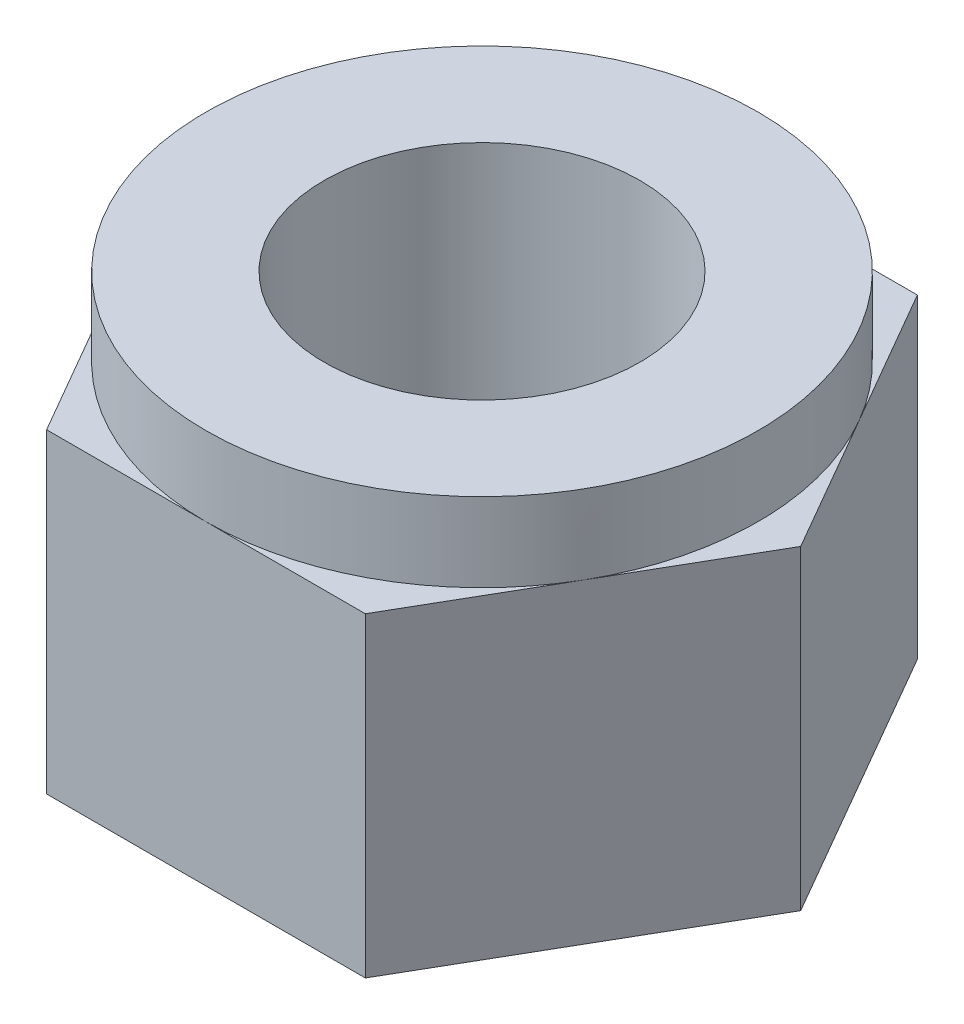
ISO-10303-21;
HEADER;
FILE_DESCRIPTION(('STEP AP214'),'2;1');
FILE_NAME('part.step','',(''),(''),'','','');
FILE_SCHEMA(('AUTOMOTIVE_DESIGN { 1 0 10303 214 1 1 1 1 }'));
ENDSEC;
DATA;
#1=APPLICATION_CONTEXT('core data for automotive mechanical design processes');
#2=APPLICATION_PROTOCOL_DEFINITION('international standard','automotive_design',2000,#1);
#3=PRODUCT_CONTEXT('',#1,'mechanical');
#4=PRODUCT('Part','Part','',(#3));
#5=PRODUCT_RELATED_PRODUCT_CATEGORY('part','',(#4));
#6=PRODUCT_DEFINITION_FORMATION('','',#4);
#7=PRODUCT_DEFINITION_CONTEXT('part definition',#1,'design');
#8=PRODUCT_DEFINITION('design','',#6,#7);
#9=PRODUCT_DEFINITION_SHAPE('','',#8);
#10=(LENGTH_UNIT() NAMED_UNIT(*) SI_UNIT(.MILLI.,.METRE.));
#11=(NAMED_UNIT(*) PLANE_ANGLE_UNIT() SI_UNIT($,.RADIAN.));
#12=(NAMED_UNIT(*) SI_UNIT($,.STERADIAN.) SOLID_ANGLE_UNIT());
#13=UNCERTAINTY_MEASURE_WITH_UNIT(LENGTH_MEASURE(1.E-05),#10,'distance_accuracy_value','');
#14=(GEOMETRIC_REPRESENTATION_CONTEXT(3) GLOBAL_UNCERTAINTY_ASSIGNED_CONTEXT((#13)) GLOBAL_UNIT_ASSIGNED_CONTEXT((#10,
#11,#12)) REPRESENTATION_CONTEXT('',''));
#15=CARTESIAN_POINT('',(0.,0.,0.));
#16=DIRECTION('',(0.,0.,1.));
#17=DIRECTION('',(1.,0.,0.));
#18=AXIS2_PLACEMENT_3D('',#15,#16,#17);
#19=CARTESIAN_POINT('',(0.,4.,0.));
#20=DIRECTION('',(0.,1.,0.));
#21=DIRECTION('',(0.,0.,1.));
#22=AXIS2_PLACEMENT_3D('',#19,#20,#21);
#23=PLANE('',#22);
#24=CARTESIAN_POINT('',(0.,4.,0.));
#25=DIRECTION('',(0.,1.,0.));
#26=DIRECTION('',(0.,0.,1.));
#27=AXIS2_PLACEMENT_3D('',#24,#25,#26);
#28=CIRCLE('',#27,3.5);
#29=CARTESIAN_POINT('',(0.,4.,3.5));
#30=VERTEX_POINT('',#29);
#31=CARTESIAN_POINT('',(3.03108891324553,4.,1.75));
#32=VERTEX_POINT('',#31);
#33=EDGE_CURVE('E54',#30,#32,#28,.T.);
#34=ORIENTED_EDGE('',*,*,#33,.F.);
#35=DIRECTION('',(1.,0.,0.));
#36=VECTOR('',#35,1.);
#37=CARTESIAN_POINT('',(-2.02072594216369,4.,3.5));
#38=LINE('',#37,#36);
#39=CARTESIAN_POINT('',(2.02072594216369,4.,3.5));
#40=VERTEX_POINT('',#39);
#41=EDGE_CURVE('E125',#30,#40,#38,.T.);
#42=ORIENTED_EDGE('',*,*,#41,.T.);
#43=DIRECTION('',(0.5,0.,-0.866025403784439));
#44=VECTOR('',#43,1.);
#45=CARTESIAN_POINT('',(2.02072594216369,4.,3.5));
#46=LINE('',#45,#44);
#47=EDGE_CURVE('E137',#40,#32,#46,.T.);
#48=ORIENTED_EDGE('',*,*,#47,.T.);
#49=EDGE_LOOP('',(#34,#42,#48));
#50=FACE_BOUND('',#49,.T.);
#51=ADVANCED_FACE('F42',(#50),#23,.T.);
#52=CARTESIAN_POINT('',(3.03108891324554,4.,-1.75));
#53=VERTEX_POINT('',#52);
#54=EDGE_CURVE('E11',#32,#53,#28,.T.);
#55=ORIENTED_EDGE('',*,*,#54,.F.);
#56=CARTESIAN_POINT('',(4.04145188432738,4.,0.));
#57=VERTEX_POINT('',#56);
#58=EDGE_CURVE('E156',#32,#57,#46,.T.);
#59=ORIENTED_EDGE('',*,*,#58,.T.);
#60=DIRECTION('',(-0.5,0.,-0.866025403784438));
#61=VECTOR('',#60,1.);
#62=CARTESIAN_POINT('',(4.04145188432738,4.,0.));
#63=LINE('',#62,#61);
#64=EDGE_CURVE('E157',#57,#53,#63,.T.);
#65=ORIENTED_EDGE('',*,*,#64,.T.);
#66=EDGE_LOOP('',(#55,#59,#65));
#67=FACE_BOUND('',#66,.T.);
#68=ADVANCED_FACE('F258',(#67),#23,.T.);
#69=CARTESIAN_POINT('',(0.,4.,-3.5));
#70=VERTEX_POINT('',#69);
#71=EDGE_CURVE('E52',#53,#70,#28,.T.);
#72=ORIENTED_EDGE('',*,*,#71,.F.);
#73=CARTESIAN_POINT('',(2.02072594216369,4.,-3.5));
#74=VERTEX_POINT('',#73);
#75=EDGE_CURVE('E155',#53,#74,#63,.T.);
#76=ORIENTED_EDGE('',*,*,#75,.T.);
#77=DIRECTION('',(-1.,0.,0.));
#78=VECTOR('',#77,1.);
#79=CARTESIAN_POINT('',(2.02072594216369,4.,-3.5));
#80=LINE('',#79,#78);
#81=EDGE_CURVE('E162',#74,#70,#80,.T.);
#82=ORIENTED_EDGE('',*,*,#81,.T.);
#83=EDGE_LOOP('',(#72,#76,#82));
#84=FACE_BOUND('',#83,.T.);
#85=ADVANCED_FACE('F262',(#84),#23,.T.);
#86=CARTESIAN_POINT('',(-3.03108891324554,4.,-1.75));
#87=VERTEX_POINT('',#86);
#88=EDGE_CURVE('E147',#70,#87,#28,.T.);
#89=ORIENTED_EDGE('',*,*,#88,.F.);
#90=CARTESIAN_POINT('',(-2.02072594216369,4.,-3.5));
#91=VERTEX_POINT('',#90);
#92=EDGE_CURVE('E161',#70,#91,#80,.T.);
#93=ORIENTED_EDGE('',*,*,#92,.T.);
#94=DIRECTION('',(-0.5,0.,0.866025403784439));
#95=VECTOR('',#94,1.);
#96=CARTESIAN_POINT('',(-2.02072594216369,4.,-3.5));
#97=LINE('',#96,#95);
#98=EDGE_CURVE('E167',#91,#87,#97,.T.);
#99=ORIENTED_EDGE('',*,*,#98,.T.);
#100=EDGE_LOOP('',(#89,#93,#99));
#101=FACE_BOUND('',#100,.T.);
#102=ADVANCED_FACE('F309',(#101),#23,.T.);
#103=CARTESIAN_POINT('',(-3.03108891324554,4.,1.75));
#104=VERTEX_POINT('',#103);
#105=EDGE_CURVE('E69',#87,#104,#28,.T.);
#106=ORIENTED_EDGE('',*,*,#105,.F.);
#107=CARTESIAN_POINT('',(-4.04145188432738,4.,0.));
#108=VERTEX_POINT('',#107);
#109=EDGE_CURVE('E166',#87,#108,#97,.T.);
#110=ORIENTED_EDGE('',*,*,#109,.T.);
#111=DIRECTION('',(0.5,0.,0.866025403784439));
#112=VECTOR('',#111,1.);
#113=CARTESIAN_POINT('',(-4.04145188432738,4.,0.));
#114=LINE('',#113,#112);
#115=EDGE_CURVE('E135',#108,#104,#114,.T.);
#116=ORIENTED_EDGE('',*,*,#115,.T.);
#117=EDGE_LOOP('',(#106,#110,#116));
#118=FACE_BOUND('',#117,.T.);
#119=ADVANCED_FACE('F228',(#118),#23,.T.);
#120=CARTESIAN_POINT('',(2.02072594216369,4.,3.5));
#121=DIRECTION('',(-0.866025403784439,0.,-0.5));
#122=DIRECTION('',(-0.5,0.,0.866025403784439));
#123=AXIS2_PLACEMENT_3D('',#120,#121,#122);
#124=PLANE('',#123);
#125=DIRECTION('',(0.5,0.,-0.866025403784439));
#126=VECTOR('',#125,1.);
#127=CARTESIAN_POINT('',(2.02072594216369,0.,3.5));
#128=LINE('',#127,#126);
#129=CARTESIAN_POINT('',(2.02072594216369,0.,3.5));
#130=VERTEX_POINT('',#129);
#131=CARTESIAN_POINT('',(4.04145188432738,0.,0.));
#132=VERTEX_POINT('',#131);
#133=EDGE_CURVE('E173',#130,#132,#128,.T.);
#134=ORIENTED_EDGE('',*,*,#133,.T.);
#135=DIRECTION('',(0.,-1.,0.));
#136=VECTOR('',#135,1.);
#137=CARTESIAN_POINT('',(4.04145188432738,4.,0.));
#138=LINE('',#137,#136);
#139=EDGE_CURVE('E46',#57,#132,#138,.T.);
#140=ORIENTED_EDGE('',*,*,#139,.F.);
#141=ORIENTED_EDGE('',*,*,#58,.F.);
#142=ORIENTED_EDGE('',*,*,#47,.F.);
#143=DIRECTION('',(0.,-1.,0.));
#144=VECTOR('',#143,1.);
#145=CARTESIAN_POINT('',(2.02072594216369,4.,3.5));
#146=LINE('',#145,#144);
#147=EDGE_CURVE('E124',#40,#130,#146,.T.);
#148=ORIENTED_EDGE('',*,*,#147,.T.);
#149=EDGE_LOOP('',(#134,#140,#141,#142,#148));
#150=FACE_BOUND('',#149,.T.);
#151=ADVANCED_FACE('F44',(#150),#124,.F.);
#152=CARTESIAN_POINT('',(4.04145188432738,4.,0.));
#153=DIRECTION('',(-0.866025403784438,0.,0.5));
#154=DIRECTION('',(0.5,0.,0.866025403784438));
#155=AXIS2_PLACEMENT_3D('',#152,#153,#154);
#156=PLANE('',#155);
#157=DIRECTION('',(-0.5,0.,-0.866025403784438));
#158=VECTOR('',#157,1.);
#159=CARTESIAN_POINT('',(4.04145188432738,0.,0.));
#160=LINE('',#159,#158);
#161=CARTESIAN_POINT('',(2.02072594216369,0.,-3.5));
#162=VERTEX_POINT('',#161);
#163=EDGE_CURVE('E177',#132,#162,#160,.T.);
#164=ORIENTED_EDGE('',*,*,#163,.T.);
#165=DIRECTION('',(0.,-1.,0.));
#166=VECTOR('',#165,1.);
#167=CARTESIAN_POINT('',(2.02072594216369,4.,-3.5));
#168=LINE('',#167,#166);
#169=EDGE_CURVE('E149',#74,#162,#168,.T.);
#170=ORIENTED_EDGE('',*,*,#169,.F.);
#171=ORIENTED_EDGE('',*,*,#75,.F.);
#172=ORIENTED_EDGE('',*,*,#64,.F.);
#173=ORIENTED_EDGE('',*,*,#139,.T.);
#174=EDGE_LOOP('',(#164,#170,#171,#172,#173));
#175=FACE_BOUND('',#174,.T.);
#176=ADVANCED_FACE('F359',(#175),#156,.F.);
#177=CARTESIAN_POINT('',(2.02072594216369,4.,-3.5));
#178=DIRECTION('',(0.,0.,1.));
#179=DIRECTION('',(1.,0.,0.));
#180=AXIS2_PLACEMENT_3D('',#177,#178,#179);
#181=PLANE('',#180);
#182=DIRECTION('',(-1.,0.,0.));
#183=VECTOR('',#182,1.);
#184=CARTESIAN_POINT('',(2.02072594216369,0.,-3.5));
#185=LINE('',#184,#183);
#186=CARTESIAN_POINT('',(-2.02072594216369,0.,-3.5));
#187=VERTEX_POINT('',#186);
#188=EDGE_CURVE('E180',#162,#187,#185,.T.);
#189=ORIENTED_EDGE('',*,*,#188,.T.);
#190=DIRECTION('',(0.,-1.,0.));
#191=VECTOR('',#190,1.);
#192=CARTESIAN_POINT('',(-2.02072594216369,4.,-3.5));
#193=LINE('',#192,#191);
#194=EDGE_CURVE('E201',#91,#187,#193,.T.);
#195=ORIENTED_EDGE('',*,*,#194,.F.);
#196=ORIENTED_EDGE('',*,*,#92,.F.);
#197=ORIENTED_EDGE('',*,*,#81,.F.);
#198=ORIENTED_EDGE('',*,*,#169,.T.);
#199=EDGE_LOOP('',(#189,#195,#196,#197,#198));
#200=FACE_BOUND('',#199,.T.);
#201=ADVANCED_FACE('F210',(#200),#181,.F.);
#202=CARTESIAN_POINT('',(-2.02072594216369,4.,-3.5));
#203=DIRECTION('',(0.866025403784439,0.,0.5));
#204=DIRECTION('',(0.5,0.,-0.866025403784439));
#205=AXIS2_PLACEMENT_3D('',#202,#203,#204);
#206=PLANE('',#205);
#207=DIRECTION('',(-0.5,0.,0.866025403784439));
#208=VECTOR('',#207,1.);
#209=CARTESIAN_POINT('',(-2.02072594216369,0.,-3.5));
#210=LINE('',#209,#208);
#211=CARTESIAN_POINT('',(-4.04145188432738,0.,0.));
#212=VERTEX_POINT('',#211);
#213=EDGE_CURVE('E183',#187,#212,#210,.T.);
#214=ORIENTED_EDGE('',*,*,#213,.T.);
#215=DIRECTION('',(0.,-1.,0.));
#216=VECTOR('',#215,1.);
#217=CARTESIAN_POINT('',(-4.04145188432738,4.,0.));
#218=LINE('',#217,#216);
#219=EDGE_CURVE('E197',#108,#212,#218,.T.);
#220=ORIENTED_EDGE('',*,*,#219,.F.);
#221=ORIENTED_EDGE('',*,*,#109,.F.);
#222=ORIENTED_EDGE('',*,*,#98,.F.);
#223=ORIENTED_EDGE('',*,*,#194,.T.);
#224=EDGE_LOOP('',(#214,#220,#221,#222,#223));
#225=FACE_BOUND('',#224,.T.);
#226=ADVANCED_FACE('F223',(#225),#206,.F.);
#227=CARTESIAN_POINT('',(-4.04145188432738,4.,0.));
#228=DIRECTION('',(0.866025403784438,0.,-0.5));
#229=DIRECTION('',(-0.5,0.,-0.866025403784439));
#230=AXIS2_PLACEMENT_3D('',#227,#228,#229);
#231=PLANE('',#230);
#232=DIRECTION('',(0.5,0.,0.866025403784439));
#233=VECTOR('',#232,1.);
#234=CARTESIAN_POINT('',(-4.04145188432738,0.,0.));
#235=LINE('',#234,#233);
#236=CARTESIAN_POINT('',(-2.02072594216369,0.,3.5));
#237=VERTEX_POINT('',#236);
#238=EDGE_CURVE('E186',#212,#237,#235,.T.);
#239=ORIENTED_EDGE('',*,*,#238,.T.);
#240=DIRECTION('',(0.,-1.,0.));
#241=VECTOR('',#240,1.);
#242=CARTESIAN_POINT('',(-2.02072594216369,4.,3.5));
#243=LINE('',#242,#241);
#244=CARTESIAN_POINT('',(-2.02072594216369,4.,3.5));
#245=VERTEX_POINT('',#244);
#246=EDGE_CURVE('E194',#245,#237,#243,.T.);
#247=ORIENTED_EDGE('',*,*,#246,.F.);
#248=EDGE_CURVE('E119',#104,#245,#114,.T.);
#249=ORIENTED_EDGE('',*,*,#248,.F.);
#250=ORIENTED_EDGE('',*,*,#115,.F.);
#251=ORIENTED_EDGE('',*,*,#219,.T.);
#252=EDGE_LOOP('',(#239,#247,#249,#250,#251));
#253=FACE_BOUND('',#252,.T.);
#254=ADVANCED_FACE('F227',(#253),#231,.F.);
#255=CARTESIAN_POINT('',(-2.02072594216369,4.,3.5));
#256=DIRECTION('',(0.,0.,-1.));
#257=DIRECTION('',(-1.,0.,0.));
#258=AXIS2_PLACEMENT_3D('',#255,#256,#257);
#259=PLANE('',#258);
#260=DIRECTION('',(1.,0.,0.));
#261=VECTOR('',#260,1.);
#262=CARTESIAN_POINT('',(-2.02072594216369,0.,3.5));
#263=LINE('',#262,#261);
#264=EDGE_CURVE('E189',#237,#130,#263,.T.);
#265=ORIENTED_EDGE('',*,*,#264,.T.);
#266=ORIENTED_EDGE('',*,*,#147,.F.);
#267=ORIENTED_EDGE('',*,*,#41,.F.);
#268=EDGE_CURVE('E116',#245,#30,#38,.T.);
#269=ORIENTED_EDGE('',*,*,#268,.F.);
#270=ORIENTED_EDGE('',*,*,#246,.T.);
#271=EDGE_LOOP('',(#265,#266,#267,#269,#270));
#272=FACE_BOUND('',#271,.T.);
#273=ADVANCED_FACE('F129',(#272),#259,.F.);
#274=EDGE_CURVE('E61',#104,#30,#28,.T.);
#275=ORIENTED_EDGE('',*,*,#274,.F.);
#276=ORIENTED_EDGE('',*,*,#248,.T.);
#277=ORIENTED_EDGE('',*,*,#268,.T.);
#278=EDGE_LOOP('',(#275,#276,#277));
#279=FACE_BOUND('',#278,.T.);
#280=ADVANCED_FACE('F118',(#279),#23,.T.);
#281=CARTESIAN_POINT('',(0.,0.,0.));
#282=DIRECTION('',(0.,1.,0.));
#283=DIRECTION('',(0.,0.,1.));
#284=AXIS2_PLACEMENT_3D('',#281,#282,#283);
#285=PLANE('',#284);
#286=CARTESIAN_POINT('',(0.,0.,0.));
#287=DIRECTION('',(0.,-1.,0.));
#288=DIRECTION('',(0.,0.,-1.));
#289=AXIS2_PLACEMENT_3D('',#286,#287,#288);
#290=CIRCLE('',#289,2.);
#291=CARTESIAN_POINT('',(0.,0.,-2.));
#292=VERTEX_POINT('',#291);
#293=EDGE_CURVE('E239',#292,#292,#290,.T.);
#294=ORIENTED_EDGE('',*,*,#293,.F.);
#295=EDGE_LOOP('',(#294));
#296=FACE_BOUND('',#295,.T.);
#297=ORIENTED_EDGE('',*,*,#133,.F.);
#298=ORIENTED_EDGE('',*,*,#264,.F.);
#299=ORIENTED_EDGE('',*,*,#238,.F.);
#300=ORIENTED_EDGE('',*,*,#213,.F.);
#301=ORIENTED_EDGE('',*,*,#188,.F.);
#302=ORIENTED_EDGE('',*,*,#163,.F.);
#303=EDGE_LOOP('',(#297,#298,#299,#300,#301,#302));
#304=FACE_BOUND('',#303,.T.);
#305=ADVANCED_FACE('F218',(#296,#304),#285,.F.);
#306=CARTESIAN_POINT('',(0.,5.,0.));
#307=DIRECTION('',(0.,-1.,0.));
#308=DIRECTION('',(0.,0.,-1.));
#309=AXIS2_PLACEMENT_3D('',#306,#307,#308);
#310=CYLINDRICAL_SURFACE('',#309,3.5);
#311=CARTESIAN_POINT('',(0.,5.,0.));
#312=DIRECTION('',(0.,1.,0.));
#313=DIRECTION('',(0.,0.,1.));
#314=AXIS2_PLACEMENT_3D('',#311,#312,#313);
#315=CIRCLE('',#314,3.5);
#316=CARTESIAN_POINT('',(0.,5.,3.5));
#317=VERTEX_POINT('',#316);
#318=EDGE_CURVE('E140',#317,#317,#315,.T.);
#319=ORIENTED_EDGE('',*,*,#318,.F.);
#320=EDGE_LOOP('',(#319));
#321=FACE_BOUND('',#320,.T.);
#322=ORIENTED_EDGE('',*,*,#33,.T.);
#323=ORIENTED_EDGE('',*,*,#54,.T.);
#324=ORIENTED_EDGE('',*,*,#71,.T.);
#325=ORIENTED_EDGE('',*,*,#88,.T.);
#326=ORIENTED_EDGE('',*,*,#105,.T.);
#327=ORIENTED_EDGE('',*,*,#274,.T.);
#328=EDGE_LOOP('',(#322,#323,#324,#325,#326,#327));
#329=FACE_BOUND('',#328,.T.);
#330=ADVANCED_FACE('F142',(#321,#329),#310,.T.);
#331=CARTESIAN_POINT('',(0.,5.,0.));
#332=DIRECTION('',(0.,1.,0.));
#333=DIRECTION('',(0.,0.,1.));
#334=AXIS2_PLACEMENT_3D('',#331,#332,#333);
#335=PLANE('',#334);
#336=CARTESIAN_POINT('',(0.,5.,0.));
#337=DIRECTION('',(0.,-1.,0.));
#338=DIRECTION('',(0.,0.,-1.));
#339=AXIS2_PLACEMENT_3D('',#336,#337,#338);
#340=CIRCLE('',#339,2.);
#341=CARTESIAN_POINT('',(0.,5.,-2.));
#342=VERTEX_POINT('',#341);
#343=EDGE_CURVE('E141',#342,#342,#340,.T.);
#344=ORIENTED_EDGE('',*,*,#343,.T.);
#345=EDGE_LOOP('',(#344));
#346=FACE_BOUND('',#345,.T.);
#347=ORIENTED_EDGE('',*,*,#318,.T.);
#348=EDGE_LOOP('',(#347));
#349=FACE_BOUND('',#348,.T.);
#350=ADVANCED_FACE('F252',(#346,#349),#335,.T.);
#351=CARTESIAN_POINT('',(0.,5.,0.));
#352=DIRECTION('',(0.,-1.,0.));
#353=DIRECTION('',(0.,0.,-1.));
#354=AXIS2_PLACEMENT_3D('',#351,#352,#353);
#355=CYLINDRICAL_SURFACE('',#354,2.);
#356=ORIENTED_EDGE('',*,*,#343,.F.);
#357=EDGE_LOOP('',(#356));
#358=FACE_BOUND('',#357,.T.);
#359=ORIENTED_EDGE('',*,*,#293,.T.);
#360=EDGE_LOOP('',(#359));
#361=FACE_BOUND('',#360,.T.);
#362=ADVANCED_FACE('F244',(#358,#361),#355,.F.);
#363=CLOSED_SHELL('',(#51,#68,#85,#102,#119,#151,#176,#201,#226,#254,#273,#280,#305,#330,#350,#362));
#364=MANIFOLD_SOLID_BREP('B2',#363);
#365=ADVANCED_BREP_SHAPE_REPRESENTATION('',(#18,#364),#14);
#366=SHAPE_DEFINITION_REPRESENTATION(#9,#365);
ENDSEC;
END-ISO-10303-21;
